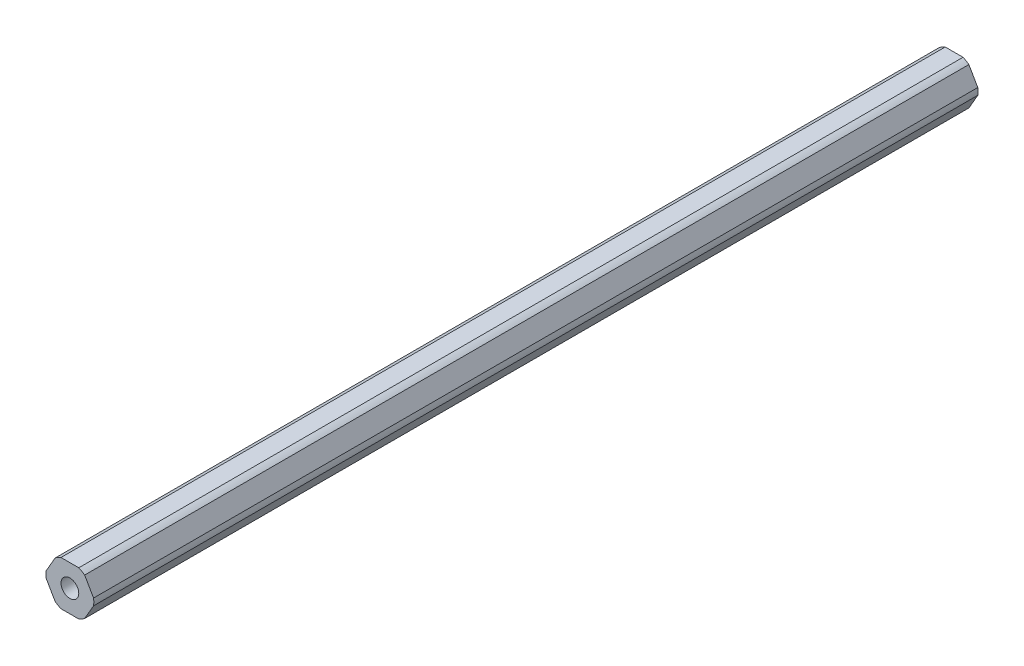
ISO-10303-21;
HEADER;
FILE_DESCRIPTION(('STEP AP214'),'2;1');
FILE_NAME('part.step','',(''),(''),'','','');
FILE_SCHEMA(('AUTOMOTIVE_DESIGN { 1 0 10303 214 1 1 1 1 }'));
ENDSEC;
DATA;
#1=APPLICATION_CONTEXT('core data for automotive mechanical design processes');
#2=APPLICATION_PROTOCOL_DEFINITION('international standard','automotive_design',2000,#1);
#3=PRODUCT_CONTEXT('',#1,'mechanical');
#4=PRODUCT('Part','Part','',(#3));
#5=PRODUCT_RELATED_PRODUCT_CATEGORY('part','',(#4));
#6=PRODUCT_DEFINITION_FORMATION('','',#4);
#7=PRODUCT_DEFINITION_CONTEXT('part definition',#1,'design');
#8=PRODUCT_DEFINITION('design','',#6,#7);
#9=PRODUCT_DEFINITION_SHAPE('','',#8);
#10=(LENGTH_UNIT() NAMED_UNIT(*) SI_UNIT(.MILLI.,.METRE.));
#11=(NAMED_UNIT(*) PLANE_ANGLE_UNIT() SI_UNIT($,.RADIAN.));
#12=(NAMED_UNIT(*) SI_UNIT($,.STERADIAN.) SOLID_ANGLE_UNIT());
#13=UNCERTAINTY_MEASURE_WITH_UNIT(LENGTH_MEASURE(1.E-05),#10,'distance_accuracy_value','');
#14=(GEOMETRIC_REPRESENTATION_CONTEXT(3) GLOBAL_UNCERTAINTY_ASSIGNED_CONTEXT((#13)) GLOBAL_UNIT_ASSIGNED_CONTEXT((#10,
#11,#12)) REPRESENTATION_CONTEXT('',''));
#15=CARTESIAN_POINT('',(0.,0.,0.));
#16=DIRECTION('',(0.,0.,1.));
#17=DIRECTION('',(1.,0.,0.));
#18=AXIS2_PLACEMENT_3D('',#15,#16,#17);
#19=CARTESIAN_POINT('',(0.,0.,-457.2));
#20=DIRECTION('',(0.,0.,1.));
#21=DIRECTION('',(1.,0.,0.));
#22=AXIS2_PLACEMENT_3D('',#19,#20,#21);
#23=CYLINDRICAL_SURFACE('',#22,6.87);
#24=CARTESIAN_POINT('',(0.,0.,203.2));
#25=DIRECTION('',(0.,0.,1.));
#26=DIRECTION('',(1.,0.,0.));
#27=AXIS2_PLACEMENT_3D('',#24,#25,#26);
#28=CIRCLE('',#27,6.87);
#29=CARTESIAN_POINT('',(6.80102150534208,0.971085209378948,203.2));
#30=VERTEX_POINT('',#29);
#31=CARTESIAN_POINT('',(6.80102150534208,-0.971085209378953,203.2));
#32=VERTEX_POINT('',#31);
#33=EDGE_CURVE('E248',#30,#32,#28,.F.);
#34=ORIENTED_EDGE('',*,*,#33,.F.);
#35=DIRECTION('',(0.,0.,1.));
#36=VECTOR('',#35,1.);
#37=CARTESIAN_POINT('',(6.80102150534208,0.97108520937895,457.2));
#38=LINE('',#37,#36);
#39=CARTESIAN_POINT('',(6.80102150534208,0.971085209378948,457.2));
#40=VERTEX_POINT('',#39);
#41=EDGE_CURVE('E139',#30,#40,#38,.T.);
#42=ORIENTED_EDGE('',*,*,#41,.T.);
#43=CARTESIAN_POINT('',(0.,0.,457.2));
#44=DIRECTION('',(0.,0.,1.));
#45=DIRECTION('',(1.,0.,0.));
#46=AXIS2_PLACEMENT_3D('',#43,#44,#45);
#47=CIRCLE('',#46,6.87);
#48=CARTESIAN_POINT('',(6.80102150534208,-0.971085209378954,457.2));
#49=VERTEX_POINT('',#48);
#50=EDGE_CURVE('E58',#40,#49,#47,.F.);
#51=ORIENTED_EDGE('',*,*,#50,.T.);
#52=DIRECTION('',(0.,0.,1.));
#53=VECTOR('',#52,1.);
#54=CARTESIAN_POINT('',(6.80102150534208,-0.971085209378955,457.2));
#55=LINE('',#54,#53);
#56=EDGE_CURVE('E154',#49,#32,#55,.F.);
#57=ORIENTED_EDGE('',*,*,#56,.T.);
#58=EDGE_LOOP('',(#34,#42,#51,#57));
#59=FACE_BOUND('',#58,.T.);
#60=ADVANCED_FACE('F34',(#59),#23,.T.);
#61=CARTESIAN_POINT('',(3.68083890619154,6.3754,457.2));
#62=DIRECTION('',(0.,-1.,0.));
#63=DIRECTION('',(1.,0.,0.));
#64=AXIS2_PLACEMENT_3D('',#61,#62,#63);
#65=PLANE('',#64);
#66=DIRECTION('',(0.,0.,1.));
#67=VECTOR('',#66,1.);
#68=CARTESIAN_POINT('',(2.55952629210953,6.37540000000001,-457.2));
#69=LINE('',#68,#67);
#70=CARTESIAN_POINT('',(2.55952629210953,6.37540000000001,203.2));
#71=VERTEX_POINT('',#70);
#72=CARTESIAN_POINT('',(2.55952629210953,6.37540000000001,457.2));
#73=VERTEX_POINT('',#72);
#74=EDGE_CURVE('E144',#71,#73,#69,.T.);
#75=ORIENTED_EDGE('',*,*,#74,.F.);
#76=DIRECTION('',(-1.,0.,0.));
#77=VECTOR('',#76,1.);
#78=CARTESIAN_POINT('',(3.68083890619154,6.3754,203.2));
#79=LINE('',#78,#77);
#80=CARTESIAN_POINT('',(-2.55952629210953,6.3754,203.2));
#81=VERTEX_POINT('',#80);
#82=EDGE_CURVE('E50',#71,#81,#79,.T.);
#83=ORIENTED_EDGE('',*,*,#82,.T.);
#84=DIRECTION('',(0.,0.,1.));
#85=VECTOR('',#84,1.);
#86=CARTESIAN_POINT('',(-2.55952629210953,6.37540000000001,-457.2));
#87=LINE('',#86,#85);
#88=CARTESIAN_POINT('',(-2.55952629210953,6.37540000000001,457.2));
#89=VERTEX_POINT('',#88);
#90=EDGE_CURVE('E171',#89,#81,#87,.F.);
#91=ORIENTED_EDGE('',*,*,#90,.F.);
#92=DIRECTION('',(1.,0.,0.));
#93=VECTOR('',#92,1.);
#94=CARTESIAN_POINT('',(0.,6.3754,457.2));
#95=LINE('',#94,#93);
#96=EDGE_CURVE('E189',#73,#89,#95,.F.);
#97=ORIENTED_EDGE('',*,*,#96,.F.);
#98=EDGE_LOOP('',(#75,#83,#91,#97));
#99=FACE_BOUND('',#98,.T.);
#100=ADVANCED_FACE('F211',(#99),#65,.F.);
#101=CARTESIAN_POINT('',(0.,0.,-457.2));
#102=DIRECTION('',(0.,0.,1.));
#103=DIRECTION('',(1.,0.,0.));
#104=AXIS2_PLACEMENT_3D('',#101,#102,#103);
#105=CYLINDRICAL_SURFACE('',#104,6.87);
#106=CARTESIAN_POINT('',(0.,0.,203.2));
#107=DIRECTION('',(0.,0.,1.));
#108=DIRECTION('',(1.,0.,0.));
#109=AXIS2_PLACEMENT_3D('',#106,#107,#108);
#110=CIRCLE('',#109,6.87);
#111=CARTESIAN_POINT('',(-4.24149521323255,5.40431479062104,203.2));
#112=VERTEX_POINT('',#111);
#113=EDGE_CURVE('E190',#112,#81,#110,.F.);
#114=ORIENTED_EDGE('',*,*,#113,.F.);
#115=DIRECTION('',(0.,0.,1.));
#116=VECTOR('',#115,1.);
#117=CARTESIAN_POINT('',(-4.24149521323255,5.40431479062104,457.2));
#118=LINE('',#117,#116);
#119=CARTESIAN_POINT('',(-4.24149521323255,5.40431479062105,457.2));
#120=VERTEX_POINT('',#119);
#121=EDGE_CURVE('E169',#112,#120,#118,.T.);
#122=ORIENTED_EDGE('',*,*,#121,.T.);
#123=CARTESIAN_POINT('',(0.,0.,457.2));
#124=DIRECTION('',(0.,0.,1.));
#125=DIRECTION('',(1.,0.,0.));
#126=AXIS2_PLACEMENT_3D('',#123,#124,#125);
#127=CIRCLE('',#126,6.87);
#128=EDGE_CURVE('E186',#89,#120,#127,.T.);
#129=ORIENTED_EDGE('',*,*,#128,.F.);
#130=ORIENTED_EDGE('',*,*,#90,.T.);
#131=EDGE_LOOP('',(#114,#122,#129,#130));
#132=FACE_BOUND('',#131,.T.);
#133=ADVANCED_FACE('F213',(#132),#105,.T.);
#134=CARTESIAN_POINT('',(-3.68083890619154,6.3754,457.2));
#135=DIRECTION('',(0.866025403784439,-0.5,0.));
#136=DIRECTION('',(0.5,0.866025403784439,0.));
#137=AXIS2_PLACEMENT_3D('',#134,#135,#136);
#138=PLANE('',#137);
#139=ORIENTED_EDGE('',*,*,#121,.F.);
#140=DIRECTION('',(-0.5,-0.866025403784439,0.));
#141=VECTOR('',#140,1.);
#142=CARTESIAN_POINT('',(-3.68083890619154,6.3754,203.2));
#143=LINE('',#142,#141);
#144=CARTESIAN_POINT('',(-6.80102150534208,0.971085209378961,203.2));
#145=VERTEX_POINT('',#144);
#146=EDGE_CURVE('E191',#112,#145,#143,.T.);
#147=ORIENTED_EDGE('',*,*,#146,.T.);
#148=DIRECTION('',(0.,0.,1.));
#149=VECTOR('',#148,1.);
#150=CARTESIAN_POINT('',(-6.80102150534208,0.971085209378959,-457.2));
#151=LINE('',#150,#149);
#152=CARTESIAN_POINT('',(-6.80102150534208,0.971085209378961,457.2));
#153=VERTEX_POINT('',#152);
#154=EDGE_CURVE('E166',#153,#145,#151,.F.);
#155=ORIENTED_EDGE('',*,*,#154,.F.);
#156=DIRECTION('',(-0.5,-0.866025403784439,0.));
#157=VECTOR('',#156,1.);
#158=CARTESIAN_POINT('',(-4.24149521323255,5.40431479062104,457.2));
#159=LINE('',#158,#157);
#160=EDGE_CURVE('E185',#120,#153,#159,.T.);
#161=ORIENTED_EDGE('',*,*,#160,.F.);
#162=EDGE_LOOP('',(#139,#147,#155,#161));
#163=FACE_BOUND('',#162,.T.);
#164=ADVANCED_FACE('F216',(#163),#138,.F.);
#165=CARTESIAN_POINT('',(0.,0.,-457.2));
#166=DIRECTION('',(0.,0.,1.));
#167=DIRECTION('',(1.,0.,0.));
#168=AXIS2_PLACEMENT_3D('',#165,#166,#167);
#169=CYLINDRICAL_SURFACE('',#168,6.87);
#170=CARTESIAN_POINT('',(0.,0.,203.2));
#171=DIRECTION('',(0.,0.,1.));
#172=DIRECTION('',(1.,0.,0.));
#173=AXIS2_PLACEMENT_3D('',#170,#171,#172);
#174=CIRCLE('',#173,6.87);
#175=CARTESIAN_POINT('',(-6.80102150534208,-0.971085209378955,203.2));
#176=VERTEX_POINT('',#175);
#177=EDGE_CURVE('E195',#176,#145,#174,.F.);
#178=ORIENTED_EDGE('',*,*,#177,.F.);
#179=DIRECTION('',(0.,0.,1.));
#180=VECTOR('',#179,1.);
#181=CARTESIAN_POINT('',(-6.80102150534208,-0.971085209378956,457.2));
#182=LINE('',#181,#180);
#183=CARTESIAN_POINT('',(-6.80102150534208,-0.971085209378955,457.2));
#184=VERTEX_POINT('',#183);
#185=EDGE_CURVE('E164',#176,#184,#182,.T.);
#186=ORIENTED_EDGE('',*,*,#185,.T.);
#187=CARTESIAN_POINT('',(0.,0.,457.2));
#188=DIRECTION('',(0.,0.,1.));
#189=DIRECTION('',(1.,0.,0.));
#190=AXIS2_PLACEMENT_3D('',#187,#188,#189);
#191=CIRCLE('',#190,6.87);
#192=EDGE_CURVE('E182',#153,#184,#191,.T.);
#193=ORIENTED_EDGE('',*,*,#192,.F.);
#194=ORIENTED_EDGE('',*,*,#154,.T.);
#195=EDGE_LOOP('',(#178,#186,#193,#194));
#196=FACE_BOUND('',#195,.T.);
#197=ADVANCED_FACE('F259',(#196),#169,.T.);
#198=CARTESIAN_POINT('',(-7.36167781238308,0.,457.2));
#199=DIRECTION('',(0.866025403784439,0.5,0.));
#200=DIRECTION('',(-0.5,0.866025403784439,0.));
#201=AXIS2_PLACEMENT_3D('',#198,#199,#200);
#202=PLANE('',#201);
#203=ORIENTED_EDGE('',*,*,#185,.F.);
#204=DIRECTION('',(0.5,-0.866025403784439,0.));
#205=VECTOR('',#204,1.);
#206=CARTESIAN_POINT('',(-7.36167781238308,0.,203.2));
#207=LINE('',#206,#205);
#208=CARTESIAN_POINT('',(-4.24149521323254,-5.40431479062105,203.2));
#209=VERTEX_POINT('',#208);
#210=EDGE_CURVE('E227',#176,#209,#207,.T.);
#211=ORIENTED_EDGE('',*,*,#210,.T.);
#212=DIRECTION('',(0.,0.,1.));
#213=VECTOR('',#212,1.);
#214=CARTESIAN_POINT('',(-4.24149521323255,-5.40431479062105,-457.2));
#215=LINE('',#214,#213);
#216=CARTESIAN_POINT('',(-4.24149521323255,-5.40431479062105,457.2));
#217=VERTEX_POINT('',#216);
#218=EDGE_CURVE('E161',#217,#209,#215,.F.);
#219=ORIENTED_EDGE('',*,*,#218,.F.);
#220=DIRECTION('',(0.5,-0.866025403784439,0.));
#221=VECTOR('',#220,1.);
#222=CARTESIAN_POINT('',(-6.80102150534208,-0.971085209378956,457.2));
#223=LINE('',#222,#221);
#224=EDGE_CURVE('E181',#184,#217,#223,.T.);
#225=ORIENTED_EDGE('',*,*,#224,.F.);
#226=EDGE_LOOP('',(#203,#211,#219,#225));
#227=FACE_BOUND('',#226,.T.);
#228=ADVANCED_FACE('F224',(#227),#202,.F.);
#229=CARTESIAN_POINT('',(0.,0.,-457.2));
#230=DIRECTION('',(0.,0.,1.));
#231=DIRECTION('',(1.,0.,0.));
#232=AXIS2_PLACEMENT_3D('',#229,#230,#231);
#233=CYLINDRICAL_SURFACE('',#232,6.87);
#234=CARTESIAN_POINT('',(0.,0.,203.2));
#235=DIRECTION('',(0.,0.,1.));
#236=DIRECTION('',(1.,0.,0.));
#237=AXIS2_PLACEMENT_3D('',#234,#235,#236);
#238=CIRCLE('',#237,6.87);
#239=CARTESIAN_POINT('',(-2.55952629210953,-6.3754,203.2));
#240=VERTEX_POINT('',#239);
#241=EDGE_CURVE('E256',#240,#209,#238,.F.);
#242=ORIENTED_EDGE('',*,*,#241,.F.);
#243=DIRECTION('',(0.,0.,1.));
#244=VECTOR('',#243,1.);
#245=CARTESIAN_POINT('',(-2.55952629210953,-6.3754,457.2));
#246=LINE('',#245,#244);
#247=CARTESIAN_POINT('',(-2.55952629210953,-6.3754,457.2));
#248=VERTEX_POINT('',#247);
#249=EDGE_CURVE('E159',#240,#248,#246,.T.);
#250=ORIENTED_EDGE('',*,*,#249,.T.);
#251=CARTESIAN_POINT('',(0.,0.,457.2));
#252=DIRECTION('',(0.,0.,1.));
#253=DIRECTION('',(1.,0.,0.));
#254=AXIS2_PLACEMENT_3D('',#251,#252,#253);
#255=CIRCLE('',#254,6.87);
#256=EDGE_CURVE('E178',#217,#248,#255,.T.);
#257=ORIENTED_EDGE('',*,*,#256,.F.);
#258=ORIENTED_EDGE('',*,*,#218,.T.);
#259=EDGE_LOOP('',(#242,#250,#257,#258));
#260=FACE_BOUND('',#259,.T.);
#261=ADVANCED_FACE('F230',(#260),#233,.T.);
#262=CARTESIAN_POINT('',(-3.68083890619154,-6.3754,457.2));
#263=DIRECTION('',(0.,1.,0.));
#264=DIRECTION('',(0.,0.,1.));
#265=AXIS2_PLACEMENT_3D('',#262,#263,#264);
#266=PLANE('',#265);
#267=ORIENTED_EDGE('',*,*,#249,.F.);
#268=DIRECTION('',(1.,0.,0.));
#269=VECTOR('',#268,1.);
#270=CARTESIAN_POINT('',(-3.68083890619154,-6.3754,203.2));
#271=LINE('',#270,#269);
#272=CARTESIAN_POINT('',(2.55952629210953,-6.3754,203.2));
#273=VERTEX_POINT('',#272);
#274=EDGE_CURVE('E238',#240,#273,#271,.T.);
#275=ORIENTED_EDGE('',*,*,#274,.T.);
#276=DIRECTION('',(0.,0.,1.));
#277=VECTOR('',#276,1.);
#278=CARTESIAN_POINT('',(2.55952629210953,-6.3754,-457.2));
#279=LINE('',#278,#277);
#280=CARTESIAN_POINT('',(2.55952629210953,-6.3754,457.2));
#281=VERTEX_POINT('',#280);
#282=EDGE_CURVE('E156',#281,#273,#279,.F.);
#283=ORIENTED_EDGE('',*,*,#282,.F.);
#284=DIRECTION('',(1.,0.,0.));
#285=VECTOR('',#284,1.);
#286=CARTESIAN_POINT('',(0.,-6.3754,457.2));
#287=LINE('',#286,#285);
#288=EDGE_CURVE('E177',#248,#281,#287,.T.);
#289=ORIENTED_EDGE('',*,*,#288,.F.);
#290=EDGE_LOOP('',(#267,#275,#283,#289));
#291=FACE_BOUND('',#290,.T.);
#292=ADVANCED_FACE('F235',(#291),#266,.F.);
#293=CARTESIAN_POINT('',(0.,0.,-457.2));
#294=DIRECTION('',(0.,0.,1.));
#295=DIRECTION('',(1.,0.,0.));
#296=AXIS2_PLACEMENT_3D('',#293,#294,#295);
#297=CYLINDRICAL_SURFACE('',#296,6.87);
#298=CARTESIAN_POINT('',(0.,0.,203.2));
#299=DIRECTION('',(0.,0.,1.));
#300=DIRECTION('',(1.,0.,0.));
#301=AXIS2_PLACEMENT_3D('',#298,#299,#300);
#302=CIRCLE('',#301,6.87);
#303=CARTESIAN_POINT('',(4.24149521323254,-5.40431479062105,203.2));
#304=VERTEX_POINT('',#303);
#305=EDGE_CURVE('E250',#304,#273,#302,.F.);
#306=ORIENTED_EDGE('',*,*,#305,.F.);
#307=DIRECTION('',(0.,0.,1.));
#308=VECTOR('',#307,1.);
#309=CARTESIAN_POINT('',(4.24149521323254,-5.40431479062105,457.2));
#310=LINE('',#309,#308);
#311=CARTESIAN_POINT('',(4.24149521323254,-5.40431479062105,457.2));
#312=VERTEX_POINT('',#311);
#313=EDGE_CURVE('E148',#304,#312,#310,.T.);
#314=ORIENTED_EDGE('',*,*,#313,.T.);
#315=CARTESIAN_POINT('',(0.,0.,457.2));
#316=DIRECTION('',(0.,0.,1.));
#317=DIRECTION('',(1.,0.,0.));
#318=AXIS2_PLACEMENT_3D('',#315,#316,#317);
#319=CIRCLE('',#318,6.87);
#320=EDGE_CURVE('E174',#281,#312,#319,.T.);
#321=ORIENTED_EDGE('',*,*,#320,.F.);
#322=ORIENTED_EDGE('',*,*,#282,.T.);
#323=EDGE_LOOP('',(#306,#314,#321,#322));
#324=FACE_BOUND('',#323,.T.);
#325=ADVANCED_FACE('F241',(#324),#297,.T.);
#326=CARTESIAN_POINT('',(3.68083890619154,-6.3754,457.2));
#327=DIRECTION('',(-0.866025403784439,0.5,0.));
#328=DIRECTION('',(-0.5,-0.866025403784439,0.));
#329=AXIS2_PLACEMENT_3D('',#326,#327,#328);
#330=PLANE('',#329);
#331=ORIENTED_EDGE('',*,*,#313,.F.);
#332=DIRECTION('',(0.5,0.866025403784439,0.));
#333=VECTOR('',#332,1.);
#334=CARTESIAN_POINT('',(3.68083890619154,-6.3754,203.2));
#335=LINE('',#334,#333);
#336=EDGE_CURVE('E247',#304,#32,#335,.T.);
#337=ORIENTED_EDGE('',*,*,#336,.T.);
#338=ORIENTED_EDGE('',*,*,#56,.F.);
#339=DIRECTION('',(0.5,0.866025403784439,0.));
#340=VECTOR('',#339,1.);
#341=CARTESIAN_POINT('',(4.24149521323254,-5.40431479062105,457.2));
#342=LINE('',#341,#340);
#343=EDGE_CURVE('E42',#312,#49,#342,.T.);
#344=ORIENTED_EDGE('',*,*,#343,.F.);
#345=EDGE_LOOP('',(#331,#337,#338,#344));
#346=FACE_BOUND('',#345,.T.);
#347=ADVANCED_FACE('F245',(#346),#330,.F.);
#348=CARTESIAN_POINT('',(7.36167781238308,0.,457.2));
#349=DIRECTION('',(-0.866025403784439,-0.5,0.));
#350=DIRECTION('',(0.5,-0.866025403784439,0.));
#351=AXIS2_PLACEMENT_3D('',#348,#349,#350);
#352=PLANE('',#351);
#353=ORIENTED_EDGE('',*,*,#41,.F.);
#354=DIRECTION('',(-0.5,0.866025403784439,0.));
#355=VECTOR('',#354,1.);
#356=CARTESIAN_POINT('',(7.36167781238308,0.,203.2));
#357=LINE('',#356,#355);
#358=CARTESIAN_POINT('',(4.24149521323254,5.40431479062105,203.2));
#359=VERTEX_POINT('',#358);
#360=EDGE_CURVE('E126',#30,#359,#357,.T.);
#361=ORIENTED_EDGE('',*,*,#360,.T.);
#362=DIRECTION('',(0.,0.,1.));
#363=VECTOR('',#362,1.);
#364=CARTESIAN_POINT('',(4.24149521323254,5.40431479062105,-457.2));
#365=LINE('',#364,#363);
#366=CARTESIAN_POINT('',(4.24149521323254,5.40431479062105,457.2));
#367=VERTEX_POINT('',#366);
#368=EDGE_CURVE('E137',#367,#359,#365,.F.);
#369=ORIENTED_EDGE('',*,*,#368,.F.);
#370=DIRECTION('',(-0.5,0.866025403784438,0.));
#371=VECTOR('',#370,1.);
#372=CARTESIAN_POINT('',(6.80102150534208,0.97108520937895,457.2));
#373=LINE('',#372,#371);
#374=EDGE_CURVE('E146',#40,#367,#373,.T.);
#375=ORIENTED_EDGE('',*,*,#374,.F.);
#376=EDGE_LOOP('',(#353,#361,#369,#375));
#377=FACE_BOUND('',#376,.T.);
#378=ADVANCED_FACE('F135',(#377),#352,.F.);
#379=CARTESIAN_POINT('',(0.,0.,-457.2));
#380=DIRECTION('',(0.,0.,1.));
#381=DIRECTION('',(1.,0.,0.));
#382=AXIS2_PLACEMENT_3D('',#379,#380,#381);
#383=CYLINDRICAL_SURFACE('',#382,6.87);
#384=CARTESIAN_POINT('',(0.,0.,203.2));
#385=DIRECTION('',(0.,0.,1.));
#386=DIRECTION('',(1.,0.,0.));
#387=AXIS2_PLACEMENT_3D('',#384,#385,#386);
#388=CIRCLE('',#387,6.87);
#389=EDGE_CURVE('E122',#71,#359,#388,.F.);
#390=ORIENTED_EDGE('',*,*,#389,.F.);
#391=ORIENTED_EDGE('',*,*,#74,.T.);
#392=CARTESIAN_POINT('',(0.,0.,457.2));
#393=DIRECTION('',(0.,0.,1.));
#394=DIRECTION('',(1.,0.,0.));
#395=AXIS2_PLACEMENT_3D('',#392,#393,#394);
#396=CIRCLE('',#395,6.87);
#397=EDGE_CURVE('E143',#367,#73,#396,.T.);
#398=ORIENTED_EDGE('',*,*,#397,.F.);
#399=ORIENTED_EDGE('',*,*,#368,.T.);
#400=EDGE_LOOP('',(#390,#391,#398,#399));
#401=FACE_BOUND('',#400,.T.);
#402=ADVANCED_FACE('F141',(#401),#383,.T.);
#403=CARTESIAN_POINT('',(0.,0.,457.2));
#404=DIRECTION('',(0.,0.,1.));
#405=DIRECTION('',(1.,0.,0.));
#406=AXIS2_PLACEMENT_3D('',#403,#404,#405);
#407=PLANE('',#406);
#408=ORIENTED_EDGE('',*,*,#343,.T.);
#409=ORIENTED_EDGE('',*,*,#50,.F.);
#410=ORIENTED_EDGE('',*,*,#374,.T.);
#411=ORIENTED_EDGE('',*,*,#397,.T.);
#412=ORIENTED_EDGE('',*,*,#96,.T.);
#413=ORIENTED_EDGE('',*,*,#128,.T.);
#414=ORIENTED_EDGE('',*,*,#160,.T.);
#415=ORIENTED_EDGE('',*,*,#192,.T.);
#416=ORIENTED_EDGE('',*,*,#224,.T.);
#417=ORIENTED_EDGE('',*,*,#256,.T.);
#418=ORIENTED_EDGE('',*,*,#288,.T.);
#419=ORIENTED_EDGE('',*,*,#320,.T.);
#420=EDGE_LOOP('',(#408,#409,#410,#411,#412,#413,#414,#415,#416,#417,#418,#419));
#421=FACE_BOUND('',#420,.T.);
#422=CARTESIAN_POINT('',(0.,0.,457.2));
#423=DIRECTION('',(0.,0.,1.));
#424=DIRECTION('',(1.,0.,0.));
#425=AXIS2_PLACEMENT_3D('',#422,#423,#424);
#426=CIRCLE('',#425,2.55);
#427=CARTESIAN_POINT('',(2.55,0.,457.2));
#428=VERTEX_POINT('',#427);
#429=EDGE_CURVE('E11',#428,#428,#426,.F.);
#430=ORIENTED_EDGE('',*,*,#429,.T.);
#431=EDGE_LOOP('',(#430));
#432=FACE_BOUND('',#431,.T.);
#433=ADVANCED_FACE('F206',(#421,#432),#407,.T.);
#434=CARTESIAN_POINT('',(0.,0.,-457.2));
#435=DIRECTION('',(0.,0.,1.));
#436=DIRECTION('',(1.,0.,0.));
#437=AXIS2_PLACEMENT_3D('',#434,#435,#436);
#438=CYLINDRICAL_SURFACE('',#437,2.55);
#439=CARTESIAN_POINT('',(0.,0.,203.2));
#440=DIRECTION('',(0.,0.,1.));
#441=DIRECTION('',(1.,0.,0.));
#442=AXIS2_PLACEMENT_3D('',#439,#440,#441);
#443=CIRCLE('',#442,2.55);
#444=CARTESIAN_POINT('',(2.55,0.,203.2));
#445=VERTEX_POINT('',#444);
#446=EDGE_CURVE('E37',#445,#445,#443,.F.);
#447=ORIENTED_EDGE('',*,*,#446,.T.);
#448=EDGE_LOOP('',(#447));
#449=FACE_BOUND('',#448,.T.);
#450=ORIENTED_EDGE('',*,*,#429,.F.);
#451=EDGE_LOOP('',(#450));
#452=FACE_BOUND('',#451,.T.);
#453=ADVANCED_FACE('F268',(#449,#452),#438,.F.);
#454=CARTESIAN_POINT('',(0.,0.,203.2));
#455=DIRECTION('',(0.,0.,1.));
#456=DIRECTION('',(1.,0.,0.));
#457=AXIS2_PLACEMENT_3D('',#454,#455,#456);
#458=PLANE('',#457);
#459=ORIENTED_EDGE('',*,*,#113,.T.);
#460=ORIENTED_EDGE('',*,*,#82,.F.);
#461=ORIENTED_EDGE('',*,*,#389,.T.);
#462=ORIENTED_EDGE('',*,*,#360,.F.);
#463=ORIENTED_EDGE('',*,*,#33,.T.);
#464=ORIENTED_EDGE('',*,*,#336,.F.);
#465=ORIENTED_EDGE('',*,*,#305,.T.);
#466=ORIENTED_EDGE('',*,*,#274,.F.);
#467=ORIENTED_EDGE('',*,*,#241,.T.);
#468=ORIENTED_EDGE('',*,*,#210,.F.);
#469=ORIENTED_EDGE('',*,*,#177,.T.);
#470=ORIENTED_EDGE('',*,*,#146,.F.);
#471=EDGE_LOOP('',(#459,#460,#461,#462,#463,#464,#465,#466,#467,#468,#469,#470));
#472=FACE_BOUND('',#471,.T.);
#473=ORIENTED_EDGE('',*,*,#446,.F.);
#474=EDGE_LOOP('',(#473));
#475=FACE_BOUND('',#474,.T.);
#476=ADVANCED_FACE('F124',(#472,#475),#458,.F.);
#477=CLOSED_SHELL('',(#60,#100,#133,#164,#197,#228,#261,#292,#325,#347,#378,#402,#433,#453,#476));
#478=MANIFOLD_SOLID_BREP('B2',#477);
#479=ADVANCED_BREP_SHAPE_REPRESENTATION('',(#18,#478),#14);
#480=SHAPE_DEFINITION_REPRESENTATION(#9,#479);
ENDSEC;
END-ISO-10303-21;
